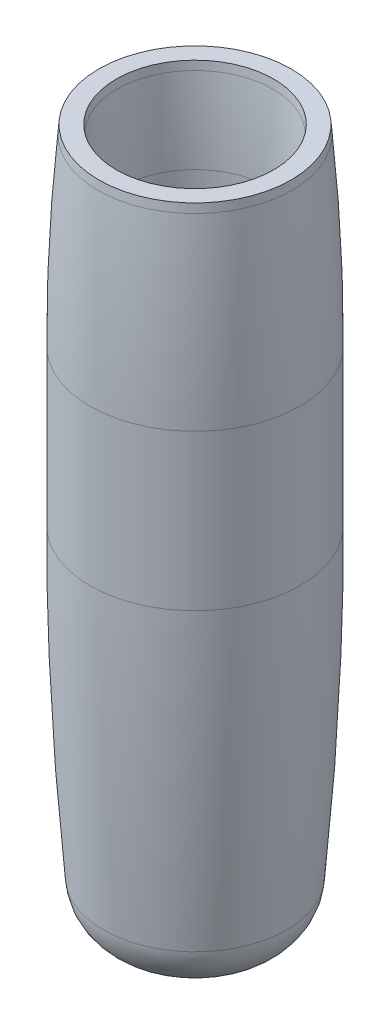
ISO-10303-21;
HEADER;
FILE_DESCRIPTION(('STEP AP214'),'2;1');
FILE_NAME('part.step','',(''),(''),'','','');
FILE_SCHEMA(('AUTOMOTIVE_DESIGN { 1 0 10303 214 1 1 1 1 }'));
ENDSEC;
DATA;
#1=APPLICATION_CONTEXT('core data for automotive mechanical design processes');
#2=APPLICATION_PROTOCOL_DEFINITION('international standard','automotive_design',2000,#1);
#3=PRODUCT_CONTEXT('',#1,'mechanical');
#4=PRODUCT('Part','Part','',(#3));
#5=PRODUCT_RELATED_PRODUCT_CATEGORY('part','',(#4));
#6=PRODUCT_DEFINITION_FORMATION('','',#4);
#7=PRODUCT_DEFINITION_CONTEXT('part definition',#1,'design');
#8=PRODUCT_DEFINITION('design','',#6,#7);
#9=PRODUCT_DEFINITION_SHAPE('','',#8);
#10=(LENGTH_UNIT() NAMED_UNIT(*) SI_UNIT(.MILLI.,.METRE.));
#11=(NAMED_UNIT(*) PLANE_ANGLE_UNIT() SI_UNIT($,.RADIAN.));
#12=(NAMED_UNIT(*) SI_UNIT($,.STERADIAN.) SOLID_ANGLE_UNIT());
#13=UNCERTAINTY_MEASURE_WITH_UNIT(LENGTH_MEASURE(1.E-05),#10,'distance_accuracy_value','');
#14=(GEOMETRIC_REPRESENTATION_CONTEXT(3) GLOBAL_UNCERTAINTY_ASSIGNED_CONTEXT((#13)) GLOBAL_UNIT_ASSIGNED_CONTEXT((#10,
#11,#12)) REPRESENTATION_CONTEXT('',''));
#15=CARTESIAN_POINT('',(0.,0.,0.));
#16=DIRECTION('',(0.,0.,1.));
#17=DIRECTION('',(1.,0.,0.));
#18=AXIS2_PLACEMENT_3D('',#15,#16,#17);
#19=CARTESIAN_POINT('',(0.,5.,0.));
#20=DIRECTION('',(0.,-1.,0.));
#21=DIRECTION('',(0.,0.,-1.));
#22=AXIS2_PLACEMENT_3D('',#19,#20,#21);
#23=CYLINDRICAL_SURFACE('',#22,6.);
#24=CARTESIAN_POINT('',(0.,29.0456606995974,0.));
#25=DIRECTION('',(0.,1.,0.));
#26=DIRECTION('',(0.,0.,1.));
#27=AXIS2_PLACEMENT_3D('',#24,#25,#26);
#28=CIRCLE('',#27,6.);
#29=CARTESIAN_POINT('',(0.,29.0456606995974,6.));
#30=VERTEX_POINT('',#29);
#31=EDGE_CURVE('E48',#30,#30,#28,.F.);
#32=ORIENTED_EDGE('',*,*,#31,.T.);
#33=EDGE_LOOP('',(#32));
#34=FACE_BOUND('',#33,.T.);
#35=CARTESIAN_POINT('',(0.,20.162240884463,0.));
#36=DIRECTION('',(0.,-1.,0.));
#37=DIRECTION('',(0.,0.,-1.));
#38=AXIS2_PLACEMENT_3D('',#35,#36,#37);
#39=CIRCLE('',#38,6.);
#40=CARTESIAN_POINT('',(0.,20.162240884463,-6.));
#41=VERTEX_POINT('',#40);
#42=EDGE_CURVE('E65',#41,#41,#39,.F.);
#43=ORIENTED_EDGE('',*,*,#42,.T.);
#44=EDGE_LOOP('',(#43));
#45=FACE_BOUND('',#44,.T.);
#46=ADVANCED_FACE('F33',(#34,#45),#23,.T.);
#47=CARTESIAN_POINT('',(0.,0.,0.));
#48=DIRECTION('',(0.,1.,0.));
#49=DIRECTION('',(0.,0.,1.));
#50=AXIS2_PLACEMENT_3D('',#47,#48,#49);
#51=PLANE('',#50);
#52=CARTESIAN_POINT('',(0.,0.,0.));
#53=DIRECTION('',(0.,1.,0.));
#54=DIRECTION('',(0.,0.,1.));
#55=AXIS2_PLACEMENT_3D('',#52,#53,#54);
#56=CIRCLE('',#55,2.25100633582409);
#57=CARTESIAN_POINT('',(0.,0.,2.25100633582409));
#58=VERTEX_POINT('',#57);
#59=EDGE_CURVE('E40',#58,#58,#56,.F.);
#60=ORIENTED_EDGE('',*,*,#59,.T.);
#61=EDGE_LOOP('',(#60));
#62=FACE_BOUND('',#61,.T.);
#63=ADVANCED_FACE('F90',(#62),#51,.F.);
#64=CARTESIAN_POINT('',(0.,40.,0.));
#65=DIRECTION('',(0.,1.,0.));
#66=DIRECTION('',(0.,0.,1.));
#67=AXIS2_PLACEMENT_3D('',#64,#65,#66);
#68=PLANE('',#67);
#69=CARTESIAN_POINT('',(0.,40.,0.));
#70=DIRECTION('',(0.,1.,0.));
#71=DIRECTION('',(0.,0.,1.));
#72=AXIS2_PLACEMENT_3D('',#69,#70,#71);
#73=CIRCLE('',#72,5.49999999999996);
#74=CARTESIAN_POINT('',(0.,40.,5.49999999999996));
#75=VERTEX_POINT('',#74);
#76=EDGE_CURVE('E53',#75,#75,#73,.T.);
#77=ORIENTED_EDGE('',*,*,#76,.T.);
#78=EDGE_LOOP('',(#77));
#79=FACE_BOUND('',#78,.T.);
#80=CARTESIAN_POINT('',(0.,40.,0.));
#81=DIRECTION('',(0.,1.,0.));
#82=DIRECTION('',(0.,0.,1.));
#83=AXIS2_PLACEMENT_3D('',#80,#81,#82);
#84=CIRCLE('',#83,4.49999999999998);
#85=CARTESIAN_POINT('',(0.,40.,4.49999999999998));
#86=VERTEX_POINT('',#85);
#87=EDGE_CURVE('E62',#86,#86,#84,.F.);
#88=ORIENTED_EDGE('',*,*,#87,.T.);
#89=EDGE_LOOP('',(#88));
#90=FACE_BOUND('',#89,.T.);
#91=ADVANCED_FACE('F84',(#79,#90),#68,.T.);
#92=CARTESIAN_POINT('',(0.,40.,0.));
#93=DIRECTION('',(0.,-1.,0.));
#94=DIRECTION('',(0.,0.,-1.));
#95=AXIS2_PLACEMENT_3D('',#92,#93,#94);
#96=CYLINDRICAL_SURFACE('',#95,4.25);
#97=CARTESIAN_POINT('',(0.,34.7585994415052,0.));
#98=DIRECTION('',(0.,-1.,0.));
#99=DIRECTION('',(0.,0.,-1.));
#100=AXIS2_PLACEMENT_3D('',#97,#98,#99);
#101=CIRCLE('',#100,4.25);
#102=CARTESIAN_POINT('',(0.,34.7585994415052,-4.25));
#103=VERTEX_POINT('',#102);
#104=EDGE_CURVE('E59',#103,#103,#101,.F.);
#105=ORIENTED_EDGE('',*,*,#104,.T.);
#106=EDGE_LOOP('',(#105));
#107=FACE_BOUND('',#106,.T.);
#108=CARTESIAN_POINT('',(0.,5.,0.));
#109=DIRECTION('',(0.,1.,0.));
#110=DIRECTION('',(0.,0.,1.));
#111=AXIS2_PLACEMENT_3D('',#108,#109,#110);
#112=CIRCLE('',#111,4.25);
#113=CARTESIAN_POINT('',(0.,5.,4.25));
#114=VERTEX_POINT('',#113);
#115=EDGE_CURVE('E68',#114,#114,#112,.F.);
#116=ORIENTED_EDGE('',*,*,#115,.T.);
#117=EDGE_LOOP('',(#116));
#118=FACE_BOUND('',#117,.T.);
#119=ADVANCED_FACE('F72',(#107,#118),#96,.F.);
#120=CARTESIAN_POINT('',(0.,5.,0.));
#121=DIRECTION('',(0.,1.,0.));
#122=DIRECTION('',(0.,0.,1.));
#123=AXIS2_PLACEMENT_3D('',#120,#121,#122);
#124=PLANE('',#123);
#125=ORIENTED_EDGE('',*,*,#115,.F.);
#126=EDGE_LOOP('',(#125));
#127=FACE_BOUND('',#126,.T.);
#128=ADVANCED_FACE('F74',(#127),#124,.T.);
#129=CARTESIAN_POINT('',(0.,20.162240884463,0.));
#130=DIRECTION('',(0.,-1.,0.));
#131=DIRECTION('',(0.,0.,-1.));
#132=AXIS2_PLACEMENT_3D('',#129,#130,#131);
#133=DEGENERATE_TOROIDAL_SURFACE('',#132,194.,200.,.F.);
#134=CARTESIAN_POINT('',(0.,2.73864607790158,0.));
#135=DIRECTION('',(0.,1.,0.));
#136=DIRECTION('',(0.,0.,1.));
#137=AXIS2_PLACEMENT_3D('',#134,#135,#136);
#138=CIRCLE('',#137,5.23960034093817);
#139=CARTESIAN_POINT('',(0.,2.73864607790158,5.23960034093817));
#140=VERTEX_POINT('',#139);
#141=EDGE_CURVE('E10',#140,#140,#138,.T.);
#142=ORIENTED_EDGE('',*,*,#141,.T.);
#143=EDGE_LOOP('',(#142));
#144=FACE_BOUND('',#143,.T.);
#145=ORIENTED_EDGE('',*,*,#42,.F.);
#146=EDGE_LOOP('',(#145));
#147=FACE_BOUND('',#146,.T.);
#148=ADVANCED_FACE('F76',(#144,#147),#133,.F.);
#149=CARTESIAN_POINT('',(0.,37.1424869243098,0.));
#150=DIRECTION('',(0.,1.,0.));
#151=DIRECTION('',(0.,0.,1.));
#152=AXIS2_PLACEMENT_3D('',#149,#150,#151);
#153=CONICAL_SURFACE('',#152,4.25,0.0872664625997136);
#154=CARTESIAN_POINT('',(0.,39.5173029955271,0.));
#155=DIRECTION('',(0.,-1.,0.));
#156=DIRECTION('',(0.,0.,-1.));
#157=AXIS2_PLACEMENT_3D('',#154,#155,#156);
#158=CIRCLE('',#157,4.45776948419068);
#159=CARTESIAN_POINT('',(0.,39.5173029955271,-4.45776948419068));
#160=VERTEX_POINT('',#159);
#161=EDGE_CURVE('E56',#160,#160,#158,.T.);
#162=ORIENTED_EDGE('',*,*,#161,.T.);
#163=EDGE_LOOP('',(#162));
#164=FACE_BOUND('',#163,.T.);
#165=ORIENTED_EDGE('',*,*,#87,.F.);
#166=EDGE_LOOP('',(#165));
#167=FACE_BOUND('',#166,.T.);
#168=ADVANCED_FACE('F82',(#164,#167),#153,.F.);
#169=CARTESIAN_POINT('',(0.,34.7585994415052,0.));
#170=DIRECTION('',(0.,-1.,0.));
#171=DIRECTION('',(0.,0.,-1.));
#172=AXIS2_PLACEMENT_3D('',#169,#170,#171);
#173=TOROIDAL_SURFACE('',#172,58.85,54.6);
#174=ORIENTED_EDGE('',*,*,#161,.F.);
#175=EDGE_LOOP('',(#174));
#176=FACE_BOUND('',#175,.T.);
#177=ORIENTED_EDGE('',*,*,#104,.F.);
#178=EDGE_LOOP('',(#177));
#179=FACE_BOUND('',#178,.T.);
#180=ADVANCED_FACE('F104',(#176,#179),#173,.T.);
#181=CARTESIAN_POINT('',(0.,40.,0.));
#182=DIRECTION('',(0.,-1.,0.));
#183=DIRECTION('',(0.,0.,-1.));
#184=AXIS2_PLACEMENT_3D('',#181,#182,#183);
#185=CONICAL_SURFACE('',#184,5.49999999999996,0.0872664625997137);
#186=CARTESIAN_POINT('',(0.,39.504349829316,0.));
#187=DIRECTION('',(0.,-1.,0.));
#188=DIRECTION('',(0.,0.,-1.));
#189=AXIS2_PLACEMENT_3D('',#186,#187,#188);
#190=CIRCLE('',#189,5.5433637710095);
#191=CARTESIAN_POINT('',(0.,39.504349829316,-5.5433637710095));
#192=VERTEX_POINT('',#191);
#193=EDGE_CURVE('E44',#192,#192,#190,.F.);
#194=ORIENTED_EDGE('',*,*,#193,.T.);
#195=EDGE_LOOP('',(#194));
#196=FACE_BOUND('',#195,.T.);
#197=ORIENTED_EDGE('',*,*,#76,.F.);
#198=EDGE_LOOP('',(#197));
#199=FACE_BOUND('',#198,.T.);
#200=ADVANCED_FACE('F108',(#196,#199),#185,.T.);
#201=CARTESIAN_POINT('',(0.,29.0456606995974,0.));
#202=DIRECTION('',(0.,1.,0.));
#203=DIRECTION('',(0.,0.,1.));
#204=AXIS2_PLACEMENT_3D('',#201,#202,#203);
#205=DEGENERATE_TOROIDAL_SURFACE('',#204,114.,120.,.F.);
#206=ORIENTED_EDGE('',*,*,#193,.F.);
#207=EDGE_LOOP('',(#206));
#208=FACE_BOUND('',#207,.T.);
#209=ORIENTED_EDGE('',*,*,#31,.F.);
#210=EDGE_LOOP('',(#209));
#211=FACE_BOUND('',#210,.T.);
#212=ADVANCED_FACE('F113',(#208,#211),#205,.F.);
#213=CARTESIAN_POINT('',(0.,3.,0.));
#214=DIRECTION('',(0.,1.,0.));
#215=DIRECTION('',(0.,0.,1.));
#216=AXIS2_PLACEMENT_3D('',#213,#214,#215);
#217=DEGENERATE_TOROIDAL_SURFACE('',#216,2.25100633582409,3.,.T.);
#218=ORIENTED_EDGE('',*,*,#141,.F.);
#219=EDGE_LOOP('',(#218));
#220=FACE_BOUND('',#219,.T.);
#221=ORIENTED_EDGE('',*,*,#59,.F.);
#222=EDGE_LOOP('',(#221));
#223=FACE_BOUND('',#222,.T.);
#224=ADVANCED_FACE('F35',(#220,#223),#217,.T.);
#225=CLOSED_SHELL('',(#46,#63,#91,#119,#128,#148,#168,#180,#200,#212,#224));
#226=MANIFOLD_SOLID_BREP('B2',#225);
#227=ADVANCED_BREP_SHAPE_REPRESENTATION('',(#18,#226),#14);
#228=SHAPE_DEFINITION_REPRESENTATION(#9,#227);
ENDSEC;
END-ISO-10303-21;
